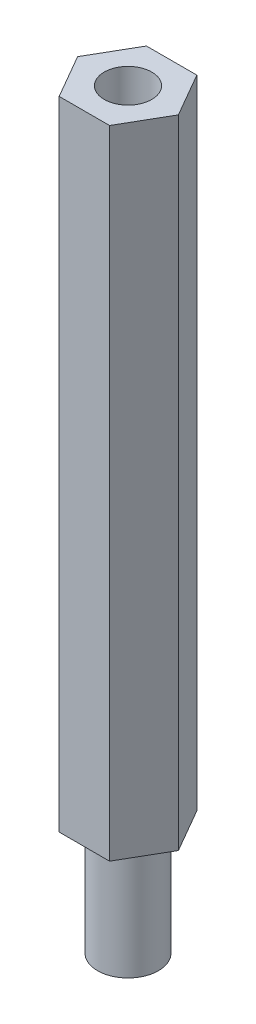
ISO-10303-21;
HEADER;
FILE_DESCRIPTION(('STEP AP214'),'2;1');
FILE_NAME('part.step','',(''),(''),'','','');
FILE_SCHEMA(('AUTOMOTIVE_DESIGN { 1 0 10303 214 1 1 1 1 }'));
ENDSEC;
DATA;
#1=APPLICATION_CONTEXT('core data for automotive mechanical design processes');
#2=APPLICATION_PROTOCOL_DEFINITION('international standard','automotive_design',2000,#1);
#3=PRODUCT_CONTEXT('',#1,'mechanical');
#4=PRODUCT('Part','Part','',(#3));
#5=PRODUCT_RELATED_PRODUCT_CATEGORY('part','',(#4));
#6=PRODUCT_DEFINITION_FORMATION('','',#4);
#7=PRODUCT_DEFINITION_CONTEXT('part definition',#1,'design');
#8=PRODUCT_DEFINITION('design','',#6,#7);
#9=PRODUCT_DEFINITION_SHAPE('','',#8);
#10=(LENGTH_UNIT() NAMED_UNIT(*) SI_UNIT(.MILLI.,.METRE.));
#11=(NAMED_UNIT(*) PLANE_ANGLE_UNIT() SI_UNIT($,.RADIAN.));
#12=(NAMED_UNIT(*) SI_UNIT($,.STERADIAN.) SOLID_ANGLE_UNIT());
#13=UNCERTAINTY_MEASURE_WITH_UNIT(LENGTH_MEASURE(1.E-05),#10,'distance_accuracy_value','');
#14=(GEOMETRIC_REPRESENTATION_CONTEXT(3) GLOBAL_UNCERTAINTY_ASSIGNED_CONTEXT((#13)) GLOBAL_UNIT_ASSIGNED_CONTEXT((#10,
#11,#12)) REPRESENTATION_CONTEXT('',''));
#15=CARTESIAN_POINT('',(0.,0.,0.));
#16=DIRECTION('',(0.,0.,1.));
#17=DIRECTION('',(1.,0.,0.));
#18=AXIS2_PLACEMENT_3D('',#15,#16,#17);
#19=CARTESIAN_POINT('',(-1.325,33.5,2.29496732002876));
#20=DIRECTION('',(0.,0.,-1.));
#21=DIRECTION('',(-1.,0.,0.));
#22=AXIS2_PLACEMENT_3D('',#19,#20,#21);
#23=PLANE('',#22);
#24=DIRECTION('',(1.,0.,0.));
#25=VECTOR('',#24,1.);
#26=CARTESIAN_POINT('',(-1.325,0.,2.29496732002876));
#27=LINE('',#26,#25);
#28=CARTESIAN_POINT('',(-1.325,0.,2.29496732002876));
#29=VERTEX_POINT('',#28);
#30=CARTESIAN_POINT('',(1.325,0.,2.29496732002876));
#31=VERTEX_POINT('',#30);
#32=EDGE_CURVE('E121',#29,#31,#27,.T.);
#33=ORIENTED_EDGE('',*,*,#32,.T.);
#34=DIRECTION('',(0.,-1.,0.));
#35=VECTOR('',#34,1.);
#36=CARTESIAN_POINT('',(1.325,33.5,2.29496732002876));
#37=LINE('',#36,#35);
#38=CARTESIAN_POINT('',(1.325,33.5,2.29496732002876));
#39=VERTEX_POINT('',#38);
#40=EDGE_CURVE('E44',#39,#31,#37,.T.);
#41=ORIENTED_EDGE('',*,*,#40,.F.);
#42=DIRECTION('',(1.,0.,0.));
#43=VECTOR('',#42,1.);
#44=CARTESIAN_POINT('',(-1.325,33.5,2.29496732002876));
#45=LINE('',#44,#43);
#46=CARTESIAN_POINT('',(-1.325,33.5,2.29496732002876));
#47=VERTEX_POINT('',#46);
#48=EDGE_CURVE('E132',#47,#39,#45,.T.);
#49=ORIENTED_EDGE('',*,*,#48,.F.);
#50=DIRECTION('',(0.,-1.,0.));
#51=VECTOR('',#50,1.);
#52=CARTESIAN_POINT('',(-1.325,33.5,2.29496732002876));
#53=LINE('',#52,#51);
#54=EDGE_CURVE('E117',#47,#29,#53,.T.);
#55=ORIENTED_EDGE('',*,*,#54,.T.);
#56=EDGE_LOOP('',(#33,#41,#49,#55));
#57=FACE_BOUND('',#56,.T.);
#58=ADVANCED_FACE('F36',(#57),#23,.F.);
#59=CARTESIAN_POINT('',(1.325,33.5,2.29496732002876));
#60=DIRECTION('',(-0.866025403784439,0.,-0.5));
#61=DIRECTION('',(-0.5,0.,0.866025403784439));
#62=AXIS2_PLACEMENT_3D('',#59,#60,#61);
#63=PLANE('',#62);
#64=DIRECTION('',(0.5,0.,-0.866025403784439));
#65=VECTOR('',#64,1.);
#66=CARTESIAN_POINT('',(1.325,0.,2.29496732002876));
#67=LINE('',#66,#65);
#68=CARTESIAN_POINT('',(2.65,0.,0.));
#69=VERTEX_POINT('',#68);
#70=EDGE_CURVE('E124',#31,#69,#67,.T.);
#71=ORIENTED_EDGE('',*,*,#70,.T.);
#72=DIRECTION('',(0.,-1.,0.));
#73=VECTOR('',#72,1.);
#74=CARTESIAN_POINT('',(2.65,33.5,0.));
#75=LINE('',#74,#73);
#76=CARTESIAN_POINT('',(2.65,33.5,0.));
#77=VERTEX_POINT('',#76);
#78=EDGE_CURVE('E136',#77,#69,#75,.T.);
#79=ORIENTED_EDGE('',*,*,#78,.F.);
#80=DIRECTION('',(0.5,0.,-0.866025403784439));
#81=VECTOR('',#80,1.);
#82=CARTESIAN_POINT('',(1.325,33.5,2.29496732002876));
#83=LINE('',#82,#81);
#84=EDGE_CURVE('E90',#39,#77,#83,.T.);
#85=ORIENTED_EDGE('',*,*,#84,.F.);
#86=ORIENTED_EDGE('',*,*,#40,.T.);
#87=EDGE_LOOP('',(#71,#79,#85,#86));
#88=FACE_BOUND('',#87,.T.);
#89=ADVANCED_FACE('F139',(#88),#63,.F.);
#90=CARTESIAN_POINT('',(2.65,33.5,0.));
#91=DIRECTION('',(-0.866025403784438,0.,0.5));
#92=DIRECTION('',(0.5,0.,0.866025403784439));
#93=AXIS2_PLACEMENT_3D('',#90,#91,#92);
#94=PLANE('',#93);
#95=DIRECTION('',(-0.5,0.,-0.866025403784439));
#96=VECTOR('',#95,1.);
#97=CARTESIAN_POINT('',(2.65,0.,0.));
#98=LINE('',#97,#96);
#99=CARTESIAN_POINT('',(1.325,0.,-2.29496732002876));
#100=VERTEX_POINT('',#99);
#101=EDGE_CURVE('E127',#69,#100,#98,.T.);
#102=ORIENTED_EDGE('',*,*,#101,.T.);
#103=DIRECTION('',(0.,-1.,0.));
#104=VECTOR('',#103,1.);
#105=CARTESIAN_POINT('',(1.325,33.5,-2.29496732002876));
#106=LINE('',#105,#104);
#107=CARTESIAN_POINT('',(1.325,33.5,-2.29496732002876));
#108=VERTEX_POINT('',#107);
#109=EDGE_CURVE('E112',#108,#100,#106,.T.);
#110=ORIENTED_EDGE('',*,*,#109,.F.);
#111=DIRECTION('',(-0.5,0.,-0.866025403784439));
#112=VECTOR('',#111,1.);
#113=CARTESIAN_POINT('',(2.65,33.5,0.));
#114=LINE('',#113,#112);
#115=EDGE_CURVE('E103',#77,#108,#114,.T.);
#116=ORIENTED_EDGE('',*,*,#115,.F.);
#117=ORIENTED_EDGE('',*,*,#78,.T.);
#118=EDGE_LOOP('',(#102,#110,#116,#117));
#119=FACE_BOUND('',#118,.T.);
#120=ADVANCED_FACE('F147',(#119),#94,.F.);
#121=CARTESIAN_POINT('',(1.325,33.5,-2.29496732002876));
#122=DIRECTION('',(0.,0.,1.));
#123=DIRECTION('',(1.,0.,0.));
#124=AXIS2_PLACEMENT_3D('',#121,#122,#123);
#125=PLANE('',#124);
#126=DIRECTION('',(-1.,0.,0.));
#127=VECTOR('',#126,1.);
#128=CARTESIAN_POINT('',(1.325,0.,-2.29496732002876));
#129=LINE('',#128,#127);
#130=CARTESIAN_POINT('',(-1.325,0.,-2.29496732002876));
#131=VERTEX_POINT('',#130);
#132=EDGE_CURVE('E111',#100,#131,#129,.T.);
#133=ORIENTED_EDGE('',*,*,#132,.T.);
#134=DIRECTION('',(0.,-1.,0.));
#135=VECTOR('',#134,1.);
#136=CARTESIAN_POINT('',(-1.325,33.5,-2.29496732002876));
#137=LINE('',#136,#135);
#138=CARTESIAN_POINT('',(-1.325,33.5,-2.29496732002876));
#139=VERTEX_POINT('',#138);
#140=EDGE_CURVE('E108',#139,#131,#137,.T.);
#141=ORIENTED_EDGE('',*,*,#140,.F.);
#142=DIRECTION('',(-1.,0.,0.));
#143=VECTOR('',#142,1.);
#144=CARTESIAN_POINT('',(1.325,33.5,-2.29496732002876));
#145=LINE('',#144,#143);
#146=EDGE_CURVE('E97',#108,#139,#145,.T.);
#147=ORIENTED_EDGE('',*,*,#146,.F.);
#148=ORIENTED_EDGE('',*,*,#109,.T.);
#149=EDGE_LOOP('',(#133,#141,#147,#148));
#150=FACE_BOUND('',#149,.T.);
#151=ADVANCED_FACE('F109',(#150),#125,.F.);
#152=CARTESIAN_POINT('',(-1.325,33.5,-2.29496732002876));
#153=DIRECTION('',(0.866025403784439,0.,0.5));
#154=DIRECTION('',(0.5,0.,-0.866025403784439));
#155=AXIS2_PLACEMENT_3D('',#152,#153,#154);
#156=PLANE('',#155);
#157=DIRECTION('',(-0.5,0.,0.866025403784439));
#158=VECTOR('',#157,1.);
#159=CARTESIAN_POINT('',(-1.325,0.,-2.29496732002876));
#160=LINE('',#159,#158);
#161=CARTESIAN_POINT('',(-2.65,0.,0.));
#162=VERTEX_POINT('',#161);
#163=EDGE_CURVE('E75',#131,#162,#160,.T.);
#164=ORIENTED_EDGE('',*,*,#163,.T.);
#165=DIRECTION('',(0.,-1.,0.));
#166=VECTOR('',#165,1.);
#167=CARTESIAN_POINT('',(-2.65,33.5,0.));
#168=LINE('',#167,#166);
#169=CARTESIAN_POINT('',(-2.65,33.5,0.));
#170=VERTEX_POINT('',#169);
#171=EDGE_CURVE('E113',#170,#162,#168,.T.);
#172=ORIENTED_EDGE('',*,*,#171,.F.);
#173=DIRECTION('',(-0.5,0.,0.866025403784439));
#174=VECTOR('',#173,1.);
#175=CARTESIAN_POINT('',(-1.325,33.5,-2.29496732002876));
#176=LINE('',#175,#174);
#177=EDGE_CURVE('E101',#139,#170,#176,.T.);
#178=ORIENTED_EDGE('',*,*,#177,.F.);
#179=ORIENTED_EDGE('',*,*,#140,.T.);
#180=EDGE_LOOP('',(#164,#172,#178,#179));
#181=FACE_BOUND('',#180,.T.);
#182=ADVANCED_FACE('F115',(#181),#156,.F.);
#183=CARTESIAN_POINT('',(-2.65,33.5,0.));
#184=DIRECTION('',(0.866025403784438,0.,-0.5));
#185=DIRECTION('',(-0.5,0.,-0.866025403784439));
#186=AXIS2_PLACEMENT_3D('',#183,#184,#185);
#187=PLANE('',#186);
#188=DIRECTION('',(0.5,0.,0.866025403784439));
#189=VECTOR('',#188,1.);
#190=CARTESIAN_POINT('',(-2.65,0.,0.));
#191=LINE('',#190,#189);
#192=EDGE_CURVE('E81',#162,#29,#191,.T.);
#193=ORIENTED_EDGE('',*,*,#192,.T.);
#194=ORIENTED_EDGE('',*,*,#54,.F.);
#195=DIRECTION('',(0.5,0.,0.866025403784439));
#196=VECTOR('',#195,1.);
#197=CARTESIAN_POINT('',(-2.65,33.5,0.));
#198=LINE('',#197,#196);
#199=EDGE_CURVE('E52',#170,#47,#198,.T.);
#200=ORIENTED_EDGE('',*,*,#199,.F.);
#201=ORIENTED_EDGE('',*,*,#171,.T.);
#202=EDGE_LOOP('',(#193,#194,#200,#201));
#203=FACE_BOUND('',#202,.T.);
#204=ADVANCED_FACE('F170',(#203),#187,.F.);
#205=CARTESIAN_POINT('',(0.,33.5,0.));
#206=DIRECTION('',(0.,1.,0.));
#207=DIRECTION('',(0.,0.,1.));
#208=AXIS2_PLACEMENT_3D('',#205,#206,#207);
#209=PLANE('',#208);
#210=CARTESIAN_POINT('',(0.,33.5,0.));
#211=DIRECTION('',(0.,1.,0.));
#212=DIRECTION('',(0.,0.,1.));
#213=AXIS2_PLACEMENT_3D('',#210,#211,#212);
#214=CIRCLE('',#213,1.25);
#215=CARTESIAN_POINT('',(0.,33.5,1.25));
#216=VERTEX_POINT('',#215);
#217=EDGE_CURVE('E154',#216,#216,#214,.T.);
#218=ORIENTED_EDGE('',*,*,#217,.F.);
#219=EDGE_LOOP('',(#218));
#220=FACE_BOUND('',#219,.T.);
#221=ORIENTED_EDGE('',*,*,#48,.T.);
#222=ORIENTED_EDGE('',*,*,#84,.T.);
#223=ORIENTED_EDGE('',*,*,#115,.T.);
#224=ORIENTED_EDGE('',*,*,#146,.T.);
#225=ORIENTED_EDGE('',*,*,#177,.T.);
#226=ORIENTED_EDGE('',*,*,#199,.T.);
#227=EDGE_LOOP('',(#221,#222,#223,#224,#225,#226));
#228=FACE_BOUND('',#227,.T.);
#229=ADVANCED_FACE('F99',(#220,#228),#209,.T.);
#230=CARTESIAN_POINT('',(0.,0.,0.));
#231=DIRECTION('',(0.,1.,0.));
#232=DIRECTION('',(0.,0.,1.));
#233=AXIS2_PLACEMENT_3D('',#230,#231,#232);
#234=PLANE('',#233);
#235=CARTESIAN_POINT('',(0.,0.,0.));
#236=DIRECTION('',(0.,1.,0.));
#237=DIRECTION('',(0.,0.,1.));
#238=AXIS2_PLACEMENT_3D('',#235,#236,#237);
#239=CIRCLE('',#238,1.6);
#240=CARTESIAN_POINT('',(0.,0.,1.6));
#241=VERTEX_POINT('',#240);
#242=EDGE_CURVE('E11',#241,#241,#239,.F.);
#243=ORIENTED_EDGE('',*,*,#242,.F.);
#244=EDGE_LOOP('',(#243));
#245=FACE_BOUND('',#244,.T.);
#246=ORIENTED_EDGE('',*,*,#32,.F.);
#247=ORIENTED_EDGE('',*,*,#192,.F.);
#248=ORIENTED_EDGE('',*,*,#163,.F.);
#249=ORIENTED_EDGE('',*,*,#132,.F.);
#250=ORIENTED_EDGE('',*,*,#101,.F.);
#251=ORIENTED_EDGE('',*,*,#70,.F.);
#252=EDGE_LOOP('',(#246,#247,#248,#249,#250,#251));
#253=FACE_BOUND('',#252,.T.);
#254=ADVANCED_FACE('F144',(#245,#253),#234,.F.);
#255=CARTESIAN_POINT('',(0.,-6.,0.));
#256=DIRECTION('',(0.,1.,0.));
#257=DIRECTION('',(0.,0.,1.));
#258=AXIS2_PLACEMENT_3D('',#255,#256,#257);
#259=CYLINDRICAL_SURFACE('',#258,1.6);
#260=CARTESIAN_POINT('',(0.,-6.,0.));
#261=DIRECTION('',(0.,-1.,0.));
#262=DIRECTION('',(0.,0.,-1.));
#263=AXIS2_PLACEMENT_3D('',#260,#261,#262);
#264=CIRCLE('',#263,1.6);
#265=CARTESIAN_POINT('',(0.,-6.,-1.6));
#266=VERTEX_POINT('',#265);
#267=EDGE_CURVE('E125',#266,#266,#264,.T.);
#268=ORIENTED_EDGE('',*,*,#267,.F.);
#269=EDGE_LOOP('',(#268));
#270=FACE_BOUND('',#269,.T.);
#271=ORIENTED_EDGE('',*,*,#242,.T.);
#272=EDGE_LOOP('',(#271));
#273=FACE_BOUND('',#272,.T.);
#274=ADVANCED_FACE('F176',(#270,#273),#259,.T.);
#275=CARTESIAN_POINT('',(0.,-6.,0.));
#276=DIRECTION('',(0.,-1.,0.));
#277=DIRECTION('',(0.,0.,-1.));
#278=AXIS2_PLACEMENT_3D('',#275,#276,#277);
#279=PLANE('',#278);
#280=ORIENTED_EDGE('',*,*,#267,.T.);
#281=EDGE_LOOP('',(#280));
#282=FACE_BOUND('',#281,.T.);
#283=ADVANCED_FACE('F165',(#282),#279,.T.);
#284=CARTESIAN_POINT('',(0.,28.5,0.));
#285=DIRECTION('',(0.,1.,0.));
#286=DIRECTION('',(0.,0.,1.));
#287=AXIS2_PLACEMENT_3D('',#284,#285,#286);
#288=CYLINDRICAL_SURFACE('',#287,1.25);
#289=CARTESIAN_POINT('',(0.,28.5,0.));
#290=DIRECTION('',(0.,1.,0.));
#291=DIRECTION('',(0.,0.,1.));
#292=AXIS2_PLACEMENT_3D('',#289,#290,#291);
#293=CIRCLE('',#292,1.25);
#294=CARTESIAN_POINT('',(0.,28.5,1.25));
#295=VERTEX_POINT('',#294);
#296=EDGE_CURVE('E153',#295,#295,#293,.T.);
#297=ORIENTED_EDGE('',*,*,#296,.F.);
#298=EDGE_LOOP('',(#297));
#299=FACE_BOUND('',#298,.T.);
#300=ORIENTED_EDGE('',*,*,#217,.T.);
#301=EDGE_LOOP('',(#300));
#302=FACE_BOUND('',#301,.T.);
#303=ADVANCED_FACE('F162',(#299,#302),#288,.F.);
#304=CARTESIAN_POINT('',(0.,28.5,0.));
#305=DIRECTION('',(0.,1.,0.));
#306=DIRECTION('',(0.,0.,1.));
#307=AXIS2_PLACEMENT_3D('',#304,#305,#306);
#308=PLANE('',#307);
#309=ORIENTED_EDGE('',*,*,#296,.T.);
#310=EDGE_LOOP('',(#309));
#311=FACE_BOUND('',#310,.T.);
#312=ADVANCED_FACE('F160',(#311),#308,.T.);
#313=CLOSED_SHELL('',(#58,#89,#120,#151,#182,#204,#229,#254,#274,#283,#303,#312));
#314=MANIFOLD_SOLID_BREP('B2',#313);
#315=ADVANCED_BREP_SHAPE_REPRESENTATION('',(#18,#314),#14);
#316=SHAPE_DEFINITION_REPRESENTATION(#9,#315);
ENDSEC;
END-ISO-10303-21;
